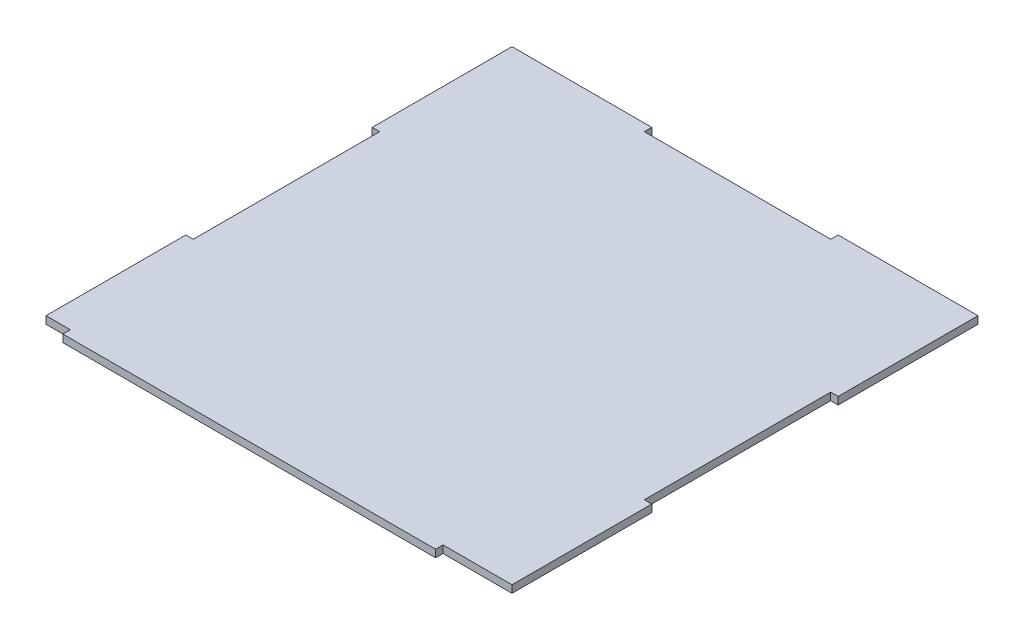
ISO-10303-21;
HEADER;
FILE_DESCRIPTION(('STEP AP214'),'2;1');
FILE_NAME('part.step','',(''),(''),'','','');
FILE_SCHEMA(('AUTOMOTIVE_DESIGN { 1 0 10303 214 1 1 1 1 }'));
ENDSEC;
DATA;
#1=APPLICATION_CONTEXT('core data for automotive mechanical design processes');
#2=APPLICATION_PROTOCOL_DEFINITION('international standard','automotive_design',2000,#1);
#3=PRODUCT_CONTEXT('',#1,'mechanical');
#4=PRODUCT('Part','Part','',(#3));
#5=PRODUCT_RELATED_PRODUCT_CATEGORY('part','',(#4));
#6=PRODUCT_DEFINITION_FORMATION('','',#4);
#7=PRODUCT_DEFINITION_CONTEXT('part definition',#1,'design');
#8=PRODUCT_DEFINITION('design','',#6,#7);
#9=PRODUCT_DEFINITION_SHAPE('','',#8);
#10=(LENGTH_UNIT() NAMED_UNIT(*) SI_UNIT(.MILLI.,.METRE.));
#11=(NAMED_UNIT(*) PLANE_ANGLE_UNIT() SI_UNIT($,.RADIAN.));
#12=(NAMED_UNIT(*) SI_UNIT($,.STERADIAN.) SOLID_ANGLE_UNIT());
#13=UNCERTAINTY_MEASURE_WITH_UNIT(LENGTH_MEASURE(1.E-05),#10,'distance_accuracy_value','');
#14=(GEOMETRIC_REPRESENTATION_CONTEXT(3) GLOBAL_UNCERTAINTY_ASSIGNED_CONTEXT((#13)) GLOBAL_UNIT_ASSIGNED_CONTEXT((#10,
#11,#12)) REPRESENTATION_CONTEXT('',''));
#15=CARTESIAN_POINT('',(0.,0.,0.));
#16=DIRECTION('',(0.,0.,1.));
#17=DIRECTION('',(1.,0.,0.));
#18=AXIS2_PLACEMENT_3D('',#15,#16,#17);
#19=CARTESIAN_POINT('',(-121.,4.,-177.352363688108));
#20=DIRECTION('',(0.,0.,1.));
#21=DIRECTION('',(1.,0.,0.));
#22=AXIS2_PLACEMENT_3D('',#19,#20,#21);
#23=PLANE('',#22);
#24=DIRECTION('',(-1.,0.,0.));
#25=VECTOR('',#24,1.);
#26=CARTESIAN_POINT('',(-121.,0.,-177.352363688108));
#27=LINE('',#26,#25);
#28=CARTESIAN_POINT('',(-121.,0.,-177.352363688108));
#29=VERTEX_POINT('',#28);
#30=CARTESIAN_POINT('',(-125.,0.,-177.352363688108));
#31=VERTEX_POINT('',#30);
#32=EDGE_CURVE('E219',#29,#31,#27,.T.);
#33=ORIENTED_EDGE('',*,*,#32,.F.);
#34=DIRECTION('',(0.,-1.,0.));
#35=VECTOR('',#34,1.);
#36=CARTESIAN_POINT('',(-121.,4.,-177.352363688108));
#37=LINE('',#36,#35);
#38=CARTESIAN_POINT('',(-121.,4.,-177.352363688108));
#39=VERTEX_POINT('',#38);
#40=EDGE_CURVE('E11',#39,#29,#37,.T.);
#41=ORIENTED_EDGE('',*,*,#40,.F.);
#42=DIRECTION('',(-1.,0.,0.));
#43=VECTOR('',#42,1.);
#44=CARTESIAN_POINT('',(-121.,4.,-177.352363688108));
#45=LINE('',#44,#43);
#46=CARTESIAN_POINT('',(-125.,4.,-177.352363688108));
#47=VERTEX_POINT('',#46);
#48=EDGE_CURVE('E291',#39,#47,#45,.T.);
#49=ORIENTED_EDGE('',*,*,#48,.T.);
#50=DIRECTION('',(0.,-1.,0.));
#51=VECTOR('',#50,1.);
#52=CARTESIAN_POINT('',(-125.,4.,-177.352363688108));
#53=LINE('',#52,#51);
#54=EDGE_CURVE('E48',#47,#31,#53,.T.);
#55=ORIENTED_EDGE('',*,*,#54,.T.);
#56=EDGE_LOOP('',(#33,#41,#49,#55));
#57=FACE_BOUND('',#56,.T.);
#58=ADVANCED_FACE('F45',(#57),#23,.T.);
#59=CARTESIAN_POINT('',(-121.,4.,-77.3523636881082));
#60=DIRECTION('',(-1.,0.,0.));
#61=DIRECTION('',(0.,0.,1.));
#62=AXIS2_PLACEMENT_3D('',#59,#60,#61);
#63=PLANE('',#62);
#64=DIRECTION('',(0.,0.,-1.));
#65=VECTOR('',#64,1.);
#66=CARTESIAN_POINT('',(-121.,0.,-77.3523636881082));
#67=LINE('',#66,#65);
#68=CARTESIAN_POINT('',(-121.,0.,-77.3523636881082));
#69=VERTEX_POINT('',#68);
#70=EDGE_CURVE('E288',#69,#29,#67,.T.);
#71=ORIENTED_EDGE('',*,*,#70,.F.);
#72=DIRECTION('',(0.,-1.,0.));
#73=VECTOR('',#72,1.);
#74=CARTESIAN_POINT('',(-121.,4.,-77.3523636881082));
#75=LINE('',#74,#73);
#76=CARTESIAN_POINT('',(-121.,4.,-77.3523636881082));
#77=VERTEX_POINT('',#76);
#78=EDGE_CURVE('E55',#77,#69,#75,.T.);
#79=ORIENTED_EDGE('',*,*,#78,.F.);
#80=DIRECTION('',(0.,0.,-1.));
#81=VECTOR('',#80,1.);
#82=CARTESIAN_POINT('',(-121.,4.,-77.3523636881082));
#83=LINE('',#82,#81);
#84=EDGE_CURVE('E204',#77,#39,#83,.T.);
#85=ORIENTED_EDGE('',*,*,#84,.T.);
#86=ORIENTED_EDGE('',*,*,#40,.T.);
#87=EDGE_LOOP('',(#71,#79,#85,#86));
#88=FACE_BOUND('',#87,.T.);
#89=ADVANCED_FACE('F349',(#88),#63,.T.);
#90=CARTESIAN_POINT('',(-125.,4.,-77.3523636881082));
#91=DIRECTION('',(0.,0.,-1.));
#92=DIRECTION('',(-1.,0.,0.));
#93=AXIS2_PLACEMENT_3D('',#90,#91,#92);
#94=PLANE('',#93);
#95=DIRECTION('',(1.,0.,0.));
#96=VECTOR('',#95,1.);
#97=CARTESIAN_POINT('',(-125.,0.,-77.3523636881082));
#98=LINE('',#97,#96);
#99=CARTESIAN_POINT('',(-125.,0.,-77.3523636881082));
#100=VERTEX_POINT('',#99);
#101=EDGE_CURVE('E192',#100,#69,#98,.T.);
#102=ORIENTED_EDGE('',*,*,#101,.F.);
#103=DIRECTION('',(0.,-1.,0.));
#104=VECTOR('',#103,1.);
#105=CARTESIAN_POINT('',(-125.,4.,-77.3523636881082));
#106=LINE('',#105,#104);
#107=CARTESIAN_POINT('',(-125.,4.,-77.3523636881082));
#108=VERTEX_POINT('',#107);
#109=EDGE_CURVE('E187',#108,#100,#106,.T.);
#110=ORIENTED_EDGE('',*,*,#109,.F.);
#111=DIRECTION('',(1.,0.,0.));
#112=VECTOR('',#111,1.);
#113=CARTESIAN_POINT('',(-125.,4.,-77.3523636881082));
#114=LINE('',#113,#112);
#115=EDGE_CURVE('E190',#108,#77,#114,.T.);
#116=ORIENTED_EDGE('',*,*,#115,.T.);
#117=ORIENTED_EDGE('',*,*,#78,.T.);
#118=EDGE_LOOP('',(#102,#110,#116,#117));
#119=FACE_BOUND('',#118,.T.);
#120=ADVANCED_FACE('F189',(#119),#94,.T.);
#121=CARTESIAN_POINT('',(-125.,4.,-2.35236368810823));
#122=DIRECTION('',(-1.,0.,0.));
#123=DIRECTION('',(0.,0.,1.));
#124=AXIS2_PLACEMENT_3D('',#121,#122,#123);
#125=PLANE('',#124);
#126=DIRECTION('',(0.,0.,-1.));
#127=VECTOR('',#126,1.);
#128=CARTESIAN_POINT('',(-125.,0.,-2.35236368810823));
#129=LINE('',#128,#127);
#130=CARTESIAN_POINT('',(-125.,0.,-2.35236368810823));
#131=VERTEX_POINT('',#130);
#132=EDGE_CURVE('E283',#131,#100,#129,.T.);
#133=ORIENTED_EDGE('',*,*,#132,.F.);
#134=DIRECTION('',(0.,-1.,0.));
#135=VECTOR('',#134,1.);
#136=CARTESIAN_POINT('',(-125.,4.,-2.35236368810823));
#137=LINE('',#136,#135);
#138=CARTESIAN_POINT('',(-125.,4.,-2.35236368810823));
#139=VERTEX_POINT('',#138);
#140=EDGE_CURVE('E198',#139,#131,#137,.T.);
#141=ORIENTED_EDGE('',*,*,#140,.F.);
#142=DIRECTION('',(0.,0.,-1.));
#143=VECTOR('',#142,1.);
#144=CARTESIAN_POINT('',(-125.,4.,-2.35236368810823));
#145=LINE('',#144,#143);
#146=EDGE_CURVE('E203',#139,#108,#145,.T.);
#147=ORIENTED_EDGE('',*,*,#146,.T.);
#148=ORIENTED_EDGE('',*,*,#109,.T.);
#149=EDGE_LOOP('',(#133,#141,#147,#148));
#150=FACE_BOUND('',#149,.T.);
#151=ADVANCED_FACE('F207',(#150),#125,.T.);
#152=CARTESIAN_POINT('',(-125.,4.,-2.35236368810823));
#153=DIRECTION('',(0.,0.,-1.));
#154=DIRECTION('',(-1.,0.,0.));
#155=AXIS2_PLACEMENT_3D('',#152,#153,#154);
#156=PLANE('',#155);
#157=DIRECTION('',(1.,0.,0.));
#158=VECTOR('',#157,1.);
#159=CARTESIAN_POINT('',(-125.,0.,-2.35236368810823));
#160=LINE('',#159,#158);
#161=CARTESIAN_POINT('',(-112.,0.,-2.35236368810826));
#162=VERTEX_POINT('',#161);
#163=EDGE_CURVE('E280',#131,#162,#160,.T.);
#164=ORIENTED_EDGE('',*,*,#163,.T.);
#165=DIRECTION('',(0.,-1.,0.));
#166=VECTOR('',#165,1.);
#167=CARTESIAN_POINT('',(-112.,4.,-2.35236368810826));
#168=LINE('',#167,#166);
#169=CARTESIAN_POINT('',(-112.,4.,-2.35236368810826));
#170=VERTEX_POINT('',#169);
#171=EDGE_CURVE('E297',#170,#162,#168,.T.);
#172=ORIENTED_EDGE('',*,*,#171,.F.);
#173=DIRECTION('',(1.,0.,0.));
#174=VECTOR('',#173,1.);
#175=CARTESIAN_POINT('',(-125.,4.,-2.35236368810823));
#176=LINE('',#175,#174);
#177=EDGE_CURVE('E210',#139,#170,#176,.T.);
#178=ORIENTED_EDGE('',*,*,#177,.F.);
#179=ORIENTED_EDGE('',*,*,#140,.T.);
#180=EDGE_LOOP('',(#164,#172,#178,#179));
#181=FACE_BOUND('',#180,.T.);
#182=ADVANCED_FACE('F362',(#181),#156,.F.);
#183=CARTESIAN_POINT('',(-112.,4.,-2.35236368810826));
#184=DIRECTION('',(1.,0.,0.));
#185=DIRECTION('',(0.,0.,-1.));
#186=AXIS2_PLACEMENT_3D('',#183,#184,#185);
#187=PLANE('',#186);
#188=DIRECTION('',(0.,0.,1.));
#189=VECTOR('',#188,1.);
#190=CARTESIAN_POINT('',(-112.,0.,-2.35236368810826));
#191=LINE('',#190,#189);
#192=CARTESIAN_POINT('',(-112.,0.,1.64763631189174));
#193=VERTEX_POINT('',#192);
#194=EDGE_CURVE('E277',#162,#193,#191,.T.);
#195=ORIENTED_EDGE('',*,*,#194,.T.);
#196=DIRECTION('',(0.,-1.,0.));
#197=VECTOR('',#196,1.);
#198=CARTESIAN_POINT('',(-112.,4.,1.64763631189174));
#199=LINE('',#198,#197);
#200=CARTESIAN_POINT('',(-112.,4.,1.64763631189174));
#201=VERTEX_POINT('',#200);
#202=EDGE_CURVE('E301',#201,#193,#199,.T.);
#203=ORIENTED_EDGE('',*,*,#202,.F.);
#204=DIRECTION('',(0.,0.,1.));
#205=VECTOR('',#204,1.);
#206=CARTESIAN_POINT('',(-112.,4.,-2.35236368810826));
#207=LINE('',#206,#205);
#208=EDGE_CURVE('E213',#170,#201,#207,.T.);
#209=ORIENTED_EDGE('',*,*,#208,.F.);
#210=ORIENTED_EDGE('',*,*,#171,.T.);
#211=EDGE_LOOP('',(#195,#203,#209,#210));
#212=FACE_BOUND('',#211,.T.);
#213=ADVANCED_FACE('F365',(#212),#187,.F.);
#214=CARTESIAN_POINT('',(-112.,4.,1.64763631189174));
#215=DIRECTION('',(0.,0.,-1.));
#216=DIRECTION('',(-1.,0.,0.));
#217=AXIS2_PLACEMENT_3D('',#214,#215,#216);
#218=PLANE('',#217);
#219=DIRECTION('',(1.,0.,0.));
#220=VECTOR('',#219,1.);
#221=CARTESIAN_POINT('',(-112.,0.,1.64763631189174));
#222=LINE('',#221,#220);
#223=CARTESIAN_POINT('',(88.0000000000001,0.,1.64763631189174));
#224=VERTEX_POINT('',#223);
#225=EDGE_CURVE('E274',#193,#224,#222,.T.);
#226=ORIENTED_EDGE('',*,*,#225,.T.);
#227=DIRECTION('',(0.,-1.,0.));
#228=VECTOR('',#227,1.);
#229=CARTESIAN_POINT('',(88.0000000000001,4.,1.64763631189174));
#230=LINE('',#229,#228);
#231=CARTESIAN_POINT('',(88.0000000000001,4.,1.64763631189174));
#232=VERTEX_POINT('',#231);
#233=EDGE_CURVE('E305',#232,#224,#230,.T.);
#234=ORIENTED_EDGE('',*,*,#233,.F.);
#235=DIRECTION('',(1.,0.,0.));
#236=VECTOR('',#235,1.);
#237=CARTESIAN_POINT('',(-112.,4.,1.64763631189174));
#238=LINE('',#237,#236);
#239=EDGE_CURVE('E600',#201,#232,#238,.T.);
#240=ORIENTED_EDGE('',*,*,#239,.F.);
#241=ORIENTED_EDGE('',*,*,#202,.T.);
#242=EDGE_LOOP('',(#226,#234,#240,#241));
#243=FACE_BOUND('',#242,.T.);
#244=ADVANCED_FACE('F369',(#243),#218,.F.);
#245=CARTESIAN_POINT('',(88.0000000000001,4.,1.64763631189174));
#246=DIRECTION('',(-1.,0.,0.));
#247=DIRECTION('',(0.,0.,1.));
#248=AXIS2_PLACEMENT_3D('',#245,#246,#247);
#249=PLANE('',#248);
#250=DIRECTION('',(0.,0.,-1.));
#251=VECTOR('',#250,1.);
#252=CARTESIAN_POINT('',(88.0000000000001,0.,1.64763631189174));
#253=LINE('',#252,#251);
#254=CARTESIAN_POINT('',(88.0000000000001,0.,-2.35236368810826));
#255=VERTEX_POINT('',#254);
#256=EDGE_CURVE('E271',#224,#255,#253,.T.);
#257=ORIENTED_EDGE('',*,*,#256,.T.);
#258=DIRECTION('',(0.,-1.,0.));
#259=VECTOR('',#258,1.);
#260=CARTESIAN_POINT('',(88.0000000000001,4.,-2.35236368810826));
#261=LINE('',#260,#259);
#262=CARTESIAN_POINT('',(88.0000000000001,4.,-2.35236368810826));
#263=VERTEX_POINT('',#262);
#264=EDGE_CURVE('E309',#263,#255,#261,.T.);
#265=ORIENTED_EDGE('',*,*,#264,.F.);
#266=DIRECTION('',(0.,0.,-1.));
#267=VECTOR('',#266,1.);
#268=CARTESIAN_POINT('',(88.0000000000001,4.,1.64763631189174));
#269=LINE('',#268,#267);
#270=EDGE_CURVE('E597',#232,#263,#269,.T.);
#271=ORIENTED_EDGE('',*,*,#270,.F.);
#272=ORIENTED_EDGE('',*,*,#233,.T.);
#273=EDGE_LOOP('',(#257,#265,#271,#272));
#274=FACE_BOUND('',#273,.T.);
#275=ADVANCED_FACE('F373',(#274),#249,.F.);
#276=CARTESIAN_POINT('',(88.0000000000001,4.,-2.35236368810826));
#277=DIRECTION('',(0.,0.,-1.));
#278=DIRECTION('',(-1.,0.,0.));
#279=AXIS2_PLACEMENT_3D('',#276,#277,#278);
#280=PLANE('',#279);
#281=DIRECTION('',(1.,0.,0.));
#282=VECTOR('',#281,1.);
#283=CARTESIAN_POINT('',(88.0000000000001,0.,-2.35236368810826));
#284=LINE('',#283,#282);
#285=CARTESIAN_POINT('',(125.,0.,-2.35236368810823));
#286=VERTEX_POINT('',#285);
#287=EDGE_CURVE('E267',#255,#286,#284,.T.);
#288=ORIENTED_EDGE('',*,*,#287,.T.);
#289=DIRECTION('',(0.,-1.,0.));
#290=VECTOR('',#289,1.);
#291=CARTESIAN_POINT('',(125.,4.,-2.35236368810823));
#292=LINE('',#291,#290);
#293=CARTESIAN_POINT('',(125.,4.,-2.35236368810823));
#294=VERTEX_POINT('',#293);
#295=EDGE_CURVE('E313',#294,#286,#292,.T.);
#296=ORIENTED_EDGE('',*,*,#295,.F.);
#297=DIRECTION('',(1.,0.,0.));
#298=VECTOR('',#297,1.);
#299=CARTESIAN_POINT('',(88.0000000000001,4.,-2.35236368810826));
#300=LINE('',#299,#298);
#301=EDGE_CURVE('E595',#263,#294,#300,.T.);
#302=ORIENTED_EDGE('',*,*,#301,.F.);
#303=ORIENTED_EDGE('',*,*,#264,.T.);
#304=EDGE_LOOP('',(#288,#296,#302,#303));
#305=FACE_BOUND('',#304,.T.);
#306=ADVANCED_FACE('F377',(#305),#280,.F.);
#307=CARTESIAN_POINT('',(125.,4.,-77.3523636881082));
#308=DIRECTION('',(1.,0.,0.));
#309=DIRECTION('',(0.,0.,-1.));
#310=AXIS2_PLACEMENT_3D('',#307,#308,#309);
#311=PLANE('',#310);
#312=DIRECTION('',(0.,0.,1.));
#313=VECTOR('',#312,1.);
#314=CARTESIAN_POINT('',(125.,0.,-77.3523636881082));
#315=LINE('',#314,#313);
#316=CARTESIAN_POINT('',(125.,0.,-77.3523636881082));
#317=VERTEX_POINT('',#316);
#318=EDGE_CURVE('E263',#317,#286,#315,.T.);
#319=ORIENTED_EDGE('',*,*,#318,.F.);
#320=DIRECTION('',(0.,-1.,0.));
#321=VECTOR('',#320,1.);
#322=CARTESIAN_POINT('',(125.,4.,-77.3523636881082));
#323=LINE('',#322,#321);
#324=CARTESIAN_POINT('',(125.,4.,-77.3523636881082));
#325=VERTEX_POINT('',#324);
#326=EDGE_CURVE('E316',#325,#317,#323,.T.);
#327=ORIENTED_EDGE('',*,*,#326,.F.);
#328=DIRECTION('',(0.,0.,1.));
#329=VECTOR('',#328,1.);
#330=CARTESIAN_POINT('',(125.,4.,-77.3523636881082));
#331=LINE('',#330,#329);
#332=EDGE_CURVE('E614',#325,#294,#331,.T.);
#333=ORIENTED_EDGE('',*,*,#332,.T.);
#334=ORIENTED_EDGE('',*,*,#295,.T.);
#335=EDGE_LOOP('',(#319,#327,#333,#334));
#336=FACE_BOUND('',#335,.T.);
#337=ADVANCED_FACE('F381',(#336),#311,.T.);
#338=CARTESIAN_POINT('',(121.,4.,-77.3523636881082));
#339=DIRECTION('',(0.,0.,-1.));
#340=DIRECTION('',(-1.,0.,0.));
#341=AXIS2_PLACEMENT_3D('',#338,#339,#340);
#342=PLANE('',#341);
#343=DIRECTION('',(1.,0.,0.));
#344=VECTOR('',#343,1.);
#345=CARTESIAN_POINT('',(121.,0.,-77.3523636881082));
#346=LINE('',#345,#344);
#347=CARTESIAN_POINT('',(121.,0.,-77.3523636881082));
#348=VERTEX_POINT('',#347);
#349=EDGE_CURVE('E259',#348,#317,#346,.T.);
#350=ORIENTED_EDGE('',*,*,#349,.F.);
#351=DIRECTION('',(0.,-1.,0.));
#352=VECTOR('',#351,1.);
#353=CARTESIAN_POINT('',(121.,4.,-77.3523636881082));
#354=LINE('',#353,#352);
#355=CARTESIAN_POINT('',(121.,4.,-77.3523636881082));
#356=VERTEX_POINT('',#355);
#357=EDGE_CURVE('E319',#356,#348,#354,.T.);
#358=ORIENTED_EDGE('',*,*,#357,.F.);
#359=DIRECTION('',(1.,0.,0.));
#360=VECTOR('',#359,1.);
#361=CARTESIAN_POINT('',(121.,4.,-77.3523636881082));
#362=LINE('',#361,#360);
#363=EDGE_CURVE('E586',#356,#325,#362,.T.);
#364=ORIENTED_EDGE('',*,*,#363,.T.);
#365=ORIENTED_EDGE('',*,*,#326,.T.);
#366=EDGE_LOOP('',(#350,#358,#364,#365));
#367=FACE_BOUND('',#366,.T.);
#368=ADVANCED_FACE('F385',(#367),#342,.T.);
#369=CARTESIAN_POINT('',(121.,4.,-177.352363688108));
#370=DIRECTION('',(1.,0.,0.));
#371=DIRECTION('',(0.,0.,-1.));
#372=AXIS2_PLACEMENT_3D('',#369,#370,#371);
#373=PLANE('',#372);
#374=DIRECTION('',(0.,0.,1.));
#375=VECTOR('',#374,1.);
#376=CARTESIAN_POINT('',(121.,0.,-177.352363688108));
#377=LINE('',#376,#375);
#378=CARTESIAN_POINT('',(121.,0.,-177.352363688108));
#379=VERTEX_POINT('',#378);
#380=EDGE_CURVE('E255',#379,#348,#377,.T.);
#381=ORIENTED_EDGE('',*,*,#380,.F.);
#382=DIRECTION('',(0.,-1.,0.));
#383=VECTOR('',#382,1.);
#384=CARTESIAN_POINT('',(121.,4.,-177.352363688108));
#385=LINE('',#384,#383);
#386=CARTESIAN_POINT('',(121.,4.,-177.352363688108));
#387=VERTEX_POINT('',#386);
#388=EDGE_CURVE('E322',#387,#379,#385,.T.);
#389=ORIENTED_EDGE('',*,*,#388,.F.);
#390=DIRECTION('',(0.,0.,1.));
#391=VECTOR('',#390,1.);
#392=CARTESIAN_POINT('',(121.,4.,-177.352363688108));
#393=LINE('',#392,#391);
#394=EDGE_CURVE('E582',#387,#356,#393,.T.);
#395=ORIENTED_EDGE('',*,*,#394,.T.);
#396=ORIENTED_EDGE('',*,*,#357,.T.);
#397=EDGE_LOOP('',(#381,#389,#395,#396));
#398=FACE_BOUND('',#397,.T.);
#399=ADVANCED_FACE('F389',(#398),#373,.T.);
#400=CARTESIAN_POINT('',(125.,4.,-177.352363688108));
#401=DIRECTION('',(0.,0.,1.));
#402=DIRECTION('',(1.,0.,0.));
#403=AXIS2_PLACEMENT_3D('',#400,#401,#402);
#404=PLANE('',#403);
#405=DIRECTION('',(-1.,0.,0.));
#406=VECTOR('',#405,1.);
#407=CARTESIAN_POINT('',(125.,0.,-177.352363688108));
#408=LINE('',#407,#406);
#409=CARTESIAN_POINT('',(125.,0.,-177.352363688108));
#410=VERTEX_POINT('',#409);
#411=EDGE_CURVE('E251',#410,#379,#408,.T.);
#412=ORIENTED_EDGE('',*,*,#411,.F.);
#413=DIRECTION('',(0.,-1.,0.));
#414=VECTOR('',#413,1.);
#415=CARTESIAN_POINT('',(125.,4.,-177.352363688108));
#416=LINE('',#415,#414);
#417=CARTESIAN_POINT('',(125.,4.,-177.352363688108));
#418=VERTEX_POINT('',#417);
#419=EDGE_CURVE('E325',#418,#410,#416,.T.);
#420=ORIENTED_EDGE('',*,*,#419,.F.);
#421=DIRECTION('',(-1.,0.,0.));
#422=VECTOR('',#421,1.);
#423=CARTESIAN_POINT('',(125.,4.,-177.352363688108));
#424=LINE('',#423,#422);
#425=EDGE_CURVE('E621',#418,#387,#424,.T.);
#426=ORIENTED_EDGE('',*,*,#425,.T.);
#427=ORIENTED_EDGE('',*,*,#388,.T.);
#428=EDGE_LOOP('',(#412,#420,#426,#427));
#429=FACE_BOUND('',#428,.T.);
#430=ADVANCED_FACE('F393',(#429),#404,.T.);
#431=CARTESIAN_POINT('',(125.,4.,-252.352363688108));
#432=DIRECTION('',(1.,0.,0.));
#433=DIRECTION('',(0.,0.,-1.));
#434=AXIS2_PLACEMENT_3D('',#431,#432,#433);
#435=PLANE('',#434);
#436=DIRECTION('',(0.,0.,1.));
#437=VECTOR('',#436,1.);
#438=CARTESIAN_POINT('',(125.,0.,-252.352363688108));
#439=LINE('',#438,#437);
#440=CARTESIAN_POINT('',(125.,0.,-252.352363688108));
#441=VERTEX_POINT('',#440);
#442=EDGE_CURVE('E247',#441,#410,#439,.T.);
#443=ORIENTED_EDGE('',*,*,#442,.F.);
#444=DIRECTION('',(0.,-1.,0.));
#445=VECTOR('',#444,1.);
#446=CARTESIAN_POINT('',(125.,4.,-252.352363688108));
#447=LINE('',#446,#445);
#448=CARTESIAN_POINT('',(125.,4.,-252.352363688108));
#449=VERTEX_POINT('',#448);
#450=EDGE_CURVE('E328',#449,#441,#447,.T.);
#451=ORIENTED_EDGE('',*,*,#450,.F.);
#452=DIRECTION('',(0.,0.,1.));
#453=VECTOR('',#452,1.);
#454=CARTESIAN_POINT('',(125.,4.,-252.352363688108));
#455=LINE('',#454,#453);
#456=EDGE_CURVE('E575',#449,#418,#455,.T.);
#457=ORIENTED_EDGE('',*,*,#456,.T.);
#458=ORIENTED_EDGE('',*,*,#419,.T.);
#459=EDGE_LOOP('',(#443,#451,#457,#458));
#460=FACE_BOUND('',#459,.T.);
#461=ADVANCED_FACE('F397',(#460),#435,.T.);
#462=CARTESIAN_POINT('',(50.,4.,-252.352363688108));
#463=DIRECTION('',(0.,0.,-1.));
#464=DIRECTION('',(-1.,0.,0.));
#465=AXIS2_PLACEMENT_3D('',#462,#463,#464);
#466=PLANE('',#465);
#467=DIRECTION('',(1.,0.,0.));
#468=VECTOR('',#467,1.);
#469=CARTESIAN_POINT('',(50.,0.,-252.352363688108));
#470=LINE('',#469,#468);
#471=CARTESIAN_POINT('',(50.,0.,-252.352363688108));
#472=VERTEX_POINT('',#471);
#473=EDGE_CURVE('E243',#472,#441,#470,.T.);
#474=ORIENTED_EDGE('',*,*,#473,.F.);
#475=DIRECTION('',(0.,-1.,0.));
#476=VECTOR('',#475,1.);
#477=CARTESIAN_POINT('',(50.,4.,-252.352363688108));
#478=LINE('',#477,#476);
#479=CARTESIAN_POINT('',(50.,4.,-252.352363688108));
#480=VERTEX_POINT('',#479);
#481=EDGE_CURVE('E331',#480,#472,#478,.T.);
#482=ORIENTED_EDGE('',*,*,#481,.F.);
#483=DIRECTION('',(1.,0.,0.));
#484=VECTOR('',#483,1.);
#485=CARTESIAN_POINT('',(50.,4.,-252.352363688108));
#486=LINE('',#485,#484);
#487=EDGE_CURVE('E571',#480,#449,#486,.T.);
#488=ORIENTED_EDGE('',*,*,#487,.T.);
#489=ORIENTED_EDGE('',*,*,#450,.T.);
#490=EDGE_LOOP('',(#474,#482,#488,#489));
#491=FACE_BOUND('',#490,.T.);
#492=ADVANCED_FACE('F401',(#491),#466,.T.);
#493=CARTESIAN_POINT('',(50.,4.,-248.352363688108));
#494=DIRECTION('',(-1.,0.,0.));
#495=DIRECTION('',(0.,0.,1.));
#496=AXIS2_PLACEMENT_3D('',#493,#494,#495);
#497=PLANE('',#496);
#498=DIRECTION('',(0.,0.,-1.));
#499=VECTOR('',#498,1.);
#500=CARTESIAN_POINT('',(50.,0.,-248.352363688108));
#501=LINE('',#500,#499);
#502=CARTESIAN_POINT('',(50.,0.,-248.352363688108));
#503=VERTEX_POINT('',#502);
#504=EDGE_CURVE('E239',#503,#472,#501,.T.);
#505=ORIENTED_EDGE('',*,*,#504,.F.);
#506=DIRECTION('',(0.,-1.,0.));
#507=VECTOR('',#506,1.);
#508=CARTESIAN_POINT('',(50.,4.,-248.352363688108));
#509=LINE('',#508,#507);
#510=CARTESIAN_POINT('',(50.,4.,-248.352363688108));
#511=VERTEX_POINT('',#510);
#512=EDGE_CURVE('E334',#511,#503,#509,.T.);
#513=ORIENTED_EDGE('',*,*,#512,.F.);
#514=DIRECTION('',(0.,0.,-1.));
#515=VECTOR('',#514,1.);
#516=CARTESIAN_POINT('',(50.,4.,-248.352363688108));
#517=LINE('',#516,#515);
#518=EDGE_CURVE('E628',#511,#480,#517,.T.);
#519=ORIENTED_EDGE('',*,*,#518,.T.);
#520=ORIENTED_EDGE('',*,*,#481,.T.);
#521=EDGE_LOOP('',(#505,#513,#519,#520));
#522=FACE_BOUND('',#521,.T.);
#523=ADVANCED_FACE('F405',(#522),#497,.T.);
#524=CARTESIAN_POINT('',(-50.,4.,-248.352363688108));
#525=DIRECTION('',(0.,0.,-1.));
#526=DIRECTION('',(-1.,0.,0.));
#527=AXIS2_PLACEMENT_3D('',#524,#525,#526);
#528=PLANE('',#527);
#529=DIRECTION('',(1.,0.,0.));
#530=VECTOR('',#529,1.);
#531=CARTESIAN_POINT('',(-50.,0.,-248.352363688108));
#532=LINE('',#531,#530);
#533=CARTESIAN_POINT('',(-50.,0.,-248.352363688108));
#534=VERTEX_POINT('',#533);
#535=EDGE_CURVE('E235',#534,#503,#532,.T.);
#536=ORIENTED_EDGE('',*,*,#535,.F.);
#537=DIRECTION('',(0.,-1.,0.));
#538=VECTOR('',#537,1.);
#539=CARTESIAN_POINT('',(-50.,4.,-248.352363688108));
#540=LINE('',#539,#538);
#541=CARTESIAN_POINT('',(-50.,4.,-248.352363688108));
#542=VERTEX_POINT('',#541);
#543=EDGE_CURVE('E337',#542,#534,#540,.T.);
#544=ORIENTED_EDGE('',*,*,#543,.F.);
#545=DIRECTION('',(1.,0.,0.));
#546=VECTOR('',#545,1.);
#547=CARTESIAN_POINT('',(-50.,4.,-248.352363688108));
#548=LINE('',#547,#546);
#549=EDGE_CURVE('E564',#542,#511,#548,.T.);
#550=ORIENTED_EDGE('',*,*,#549,.T.);
#551=ORIENTED_EDGE('',*,*,#512,.T.);
#552=EDGE_LOOP('',(#536,#544,#550,#551));
#553=FACE_BOUND('',#552,.T.);
#554=ADVANCED_FACE('F409',(#553),#528,.T.);
#555=CARTESIAN_POINT('',(-50.,4.,-252.352363688108));
#556=DIRECTION('',(1.,0.,0.));
#557=DIRECTION('',(0.,0.,-1.));
#558=AXIS2_PLACEMENT_3D('',#555,#556,#557);
#559=PLANE('',#558);
#560=DIRECTION('',(0.,0.,1.));
#561=VECTOR('',#560,1.);
#562=CARTESIAN_POINT('',(-50.,0.,-252.352363688108));
#563=LINE('',#562,#561);
#564=CARTESIAN_POINT('',(-50.,0.,-252.352363688108));
#565=VERTEX_POINT('',#564);
#566=EDGE_CURVE('E231',#565,#534,#563,.T.);
#567=ORIENTED_EDGE('',*,*,#566,.F.);
#568=DIRECTION('',(0.,-1.,0.));
#569=VECTOR('',#568,1.);
#570=CARTESIAN_POINT('',(-50.,4.,-252.352363688108));
#571=LINE('',#570,#569);
#572=CARTESIAN_POINT('',(-50.,4.,-252.352363688108));
#573=VERTEX_POINT('',#572);
#574=EDGE_CURVE('E340',#573,#565,#571,.T.);
#575=ORIENTED_EDGE('',*,*,#574,.F.);
#576=DIRECTION('',(0.,0.,1.));
#577=VECTOR('',#576,1.);
#578=CARTESIAN_POINT('',(-50.,4.,-252.352363688108));
#579=LINE('',#578,#577);
#580=EDGE_CURVE('E560',#573,#542,#579,.T.);
#581=ORIENTED_EDGE('',*,*,#580,.T.);
#582=ORIENTED_EDGE('',*,*,#543,.T.);
#583=EDGE_LOOP('',(#567,#575,#581,#582));
#584=FACE_BOUND('',#583,.T.);
#585=ADVANCED_FACE('F413',(#584),#559,.T.);
#586=CARTESIAN_POINT('',(-125.,4.,-252.352363688108));
#587=DIRECTION('',(0.,0.,-1.));
#588=DIRECTION('',(-1.,0.,0.));
#589=AXIS2_PLACEMENT_3D('',#586,#587,#588);
#590=PLANE('',#589);
#591=DIRECTION('',(1.,0.,0.));
#592=VECTOR('',#591,1.);
#593=CARTESIAN_POINT('',(-125.,0.,-252.352363688108));
#594=LINE('',#593,#592);
#595=CARTESIAN_POINT('',(-125.,0.,-252.352363688108));
#596=VERTEX_POINT('',#595);
#597=EDGE_CURVE('E227',#596,#565,#594,.T.);
#598=ORIENTED_EDGE('',*,*,#597,.F.);
#599=DIRECTION('',(0.,-1.,0.));
#600=VECTOR('',#599,1.);
#601=CARTESIAN_POINT('',(-125.,4.,-252.352363688108));
#602=LINE('',#601,#600);
#603=CARTESIAN_POINT('',(-125.,4.,-252.352363688108));
#604=VERTEX_POINT('',#603);
#605=EDGE_CURVE('E342',#604,#596,#602,.T.);
#606=ORIENTED_EDGE('',*,*,#605,.F.);
#607=DIRECTION('',(1.,0.,0.));
#608=VECTOR('',#607,1.);
#609=CARTESIAN_POINT('',(-125.,4.,-252.352363688108));
#610=LINE('',#609,#608);
#611=EDGE_CURVE('E635',#604,#573,#610,.T.);
#612=ORIENTED_EDGE('',*,*,#611,.T.);
#613=ORIENTED_EDGE('',*,*,#574,.T.);
#614=EDGE_LOOP('',(#598,#606,#612,#613));
#615=FACE_BOUND('',#614,.T.);
#616=ADVANCED_FACE('F417',(#615),#590,.T.);
#617=CARTESIAN_POINT('',(-125.,4.,-177.352363688108));
#618=DIRECTION('',(-1.,0.,0.));
#619=DIRECTION('',(0.,0.,1.));
#620=AXIS2_PLACEMENT_3D('',#617,#618,#619);
#621=PLANE('',#620);
#622=DIRECTION('',(0.,0.,-1.));
#623=VECTOR('',#622,1.);
#624=CARTESIAN_POINT('',(-125.,0.,-177.352363688108));
#625=LINE('',#624,#623);
#626=EDGE_CURVE('E223',#31,#596,#625,.T.);
#627=ORIENTED_EDGE('',*,*,#626,.F.);
#628=ORIENTED_EDGE('',*,*,#54,.F.);
#629=DIRECTION('',(0.,0.,-1.));
#630=VECTOR('',#629,1.);
#631=CARTESIAN_POINT('',(-125.,4.,-177.352363688108));
#632=LINE('',#631,#630);
#633=EDGE_CURVE('E638',#47,#604,#632,.T.);
#634=ORIENTED_EDGE('',*,*,#633,.T.);
#635=ORIENTED_EDGE('',*,*,#605,.T.);
#636=EDGE_LOOP('',(#627,#628,#634,#635));
#637=FACE_BOUND('',#636,.T.);
#638=ADVANCED_FACE('F346',(#637),#621,.T.);
#639=CARTESIAN_POINT('',(0.,4.,0.));
#640=DIRECTION('',(0.,-1.,0.));
#641=DIRECTION('',(0.,0.,-1.));
#642=AXIS2_PLACEMENT_3D('',#639,#640,#641);
#643=PLANE('',#642);
#644=ORIENTED_EDGE('',*,*,#48,.F.);
#645=ORIENTED_EDGE('',*,*,#84,.F.);
#646=ORIENTED_EDGE('',*,*,#115,.F.);
#647=ORIENTED_EDGE('',*,*,#146,.F.);
#648=ORIENTED_EDGE('',*,*,#177,.T.);
#649=ORIENTED_EDGE('',*,*,#208,.T.);
#650=ORIENTED_EDGE('',*,*,#239,.T.);
#651=ORIENTED_EDGE('',*,*,#270,.T.);
#652=ORIENTED_EDGE('',*,*,#301,.T.);
#653=ORIENTED_EDGE('',*,*,#332,.F.);
#654=ORIENTED_EDGE('',*,*,#363,.F.);
#655=ORIENTED_EDGE('',*,*,#394,.F.);
#656=ORIENTED_EDGE('',*,*,#425,.F.);
#657=ORIENTED_EDGE('',*,*,#456,.F.);
#658=ORIENTED_EDGE('',*,*,#487,.F.);
#659=ORIENTED_EDGE('',*,*,#518,.F.);
#660=ORIENTED_EDGE('',*,*,#549,.F.);
#661=ORIENTED_EDGE('',*,*,#580,.F.);
#662=ORIENTED_EDGE('',*,*,#611,.F.);
#663=ORIENTED_EDGE('',*,*,#633,.F.);
#664=EDGE_LOOP('',(#644,#645,#646,#647,#648,#649,#650,#651,#652,#653,#654,#655,#656,#657,#658,
#659,#660,#661,#662,#663));
#665=FACE_BOUND('',#664,.T.);
#666=ADVANCED_FACE('F202',(#665),#643,.F.);
#667=CARTESIAN_POINT('',(0.,0.,0.));
#668=DIRECTION('',(0.,-1.,0.));
#669=DIRECTION('',(0.,0.,-1.));
#670=AXIS2_PLACEMENT_3D('',#667,#668,#669);
#671=PLANE('',#670);
#672=ORIENTED_EDGE('',*,*,#32,.T.);
#673=ORIENTED_EDGE('',*,*,#626,.T.);
#674=ORIENTED_EDGE('',*,*,#597,.T.);
#675=ORIENTED_EDGE('',*,*,#566,.T.);
#676=ORIENTED_EDGE('',*,*,#535,.T.);
#677=ORIENTED_EDGE('',*,*,#504,.T.);
#678=ORIENTED_EDGE('',*,*,#473,.T.);
#679=ORIENTED_EDGE('',*,*,#442,.T.);
#680=ORIENTED_EDGE('',*,*,#411,.T.);
#681=ORIENTED_EDGE('',*,*,#380,.T.);
#682=ORIENTED_EDGE('',*,*,#349,.T.);
#683=ORIENTED_EDGE('',*,*,#318,.T.);
#684=ORIENTED_EDGE('',*,*,#287,.F.);
#685=ORIENTED_EDGE('',*,*,#256,.F.);
#686=ORIENTED_EDGE('',*,*,#225,.F.);
#687=ORIENTED_EDGE('',*,*,#194,.F.);
#688=ORIENTED_EDGE('',*,*,#163,.F.);
#689=ORIENTED_EDGE('',*,*,#132,.T.);
#690=ORIENTED_EDGE('',*,*,#101,.T.);
#691=ORIENTED_EDGE('',*,*,#70,.T.);
#692=EDGE_LOOP('',(#672,#673,#674,#675,#676,#677,#678,#679,#680,#681,#682,#683,#684,#685,#686,
#687,#688,#689,#690,#691));
#693=FACE_BOUND('',#692,.T.);
#694=ADVANCED_FACE('F348',(#693),#671,.T.);
#695=CLOSED_SHELL('',(#58,#89,#120,#151,#182,#213,#244,#275,#306,#337,#368,#399,#430,#461,#492,
#523,#554,#585,#616,#638,#666,#694));
#696=MANIFOLD_SOLID_BREP('B2',#695);
#697=ADVANCED_BREP_SHAPE_REPRESENTATION('',(#18,#696),#14);
#698=SHAPE_DEFINITION_REPRESENTATION(#9,#697);
ENDSEC;
END-ISO-10303-21;
